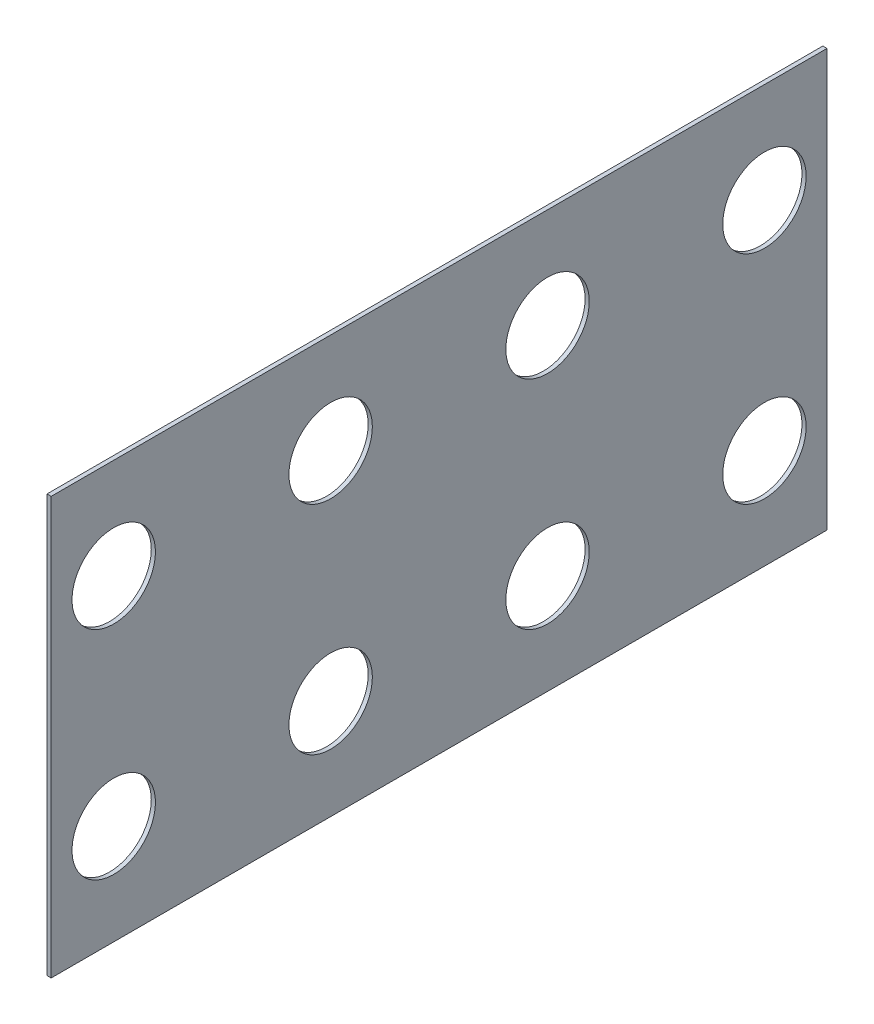
ISO-10303-21;
HEADER;
FILE_DESCRIPTION(('STEP AP214'),'2;1');
FILE_NAME('part.step','',(''),(''),'','','');
FILE_SCHEMA(('AUTOMOTIVE_DESIGN { 1 0 10303 214 1 1 1 1 }'));
ENDSEC;
DATA;
#1=APPLICATION_CONTEXT('core data for automotive mechanical design processes');
#2=APPLICATION_PROTOCOL_DEFINITION('international standard','automotive_design',2000,#1);
#3=PRODUCT_CONTEXT('',#1,'mechanical');
#4=PRODUCT('Part','Part','',(#3));
#5=PRODUCT_RELATED_PRODUCT_CATEGORY('part','',(#4));
#6=PRODUCT_DEFINITION_FORMATION('','',#4);
#7=PRODUCT_DEFINITION_CONTEXT('part definition',#1,'design');
#8=PRODUCT_DEFINITION('design','',#6,#7);
#9=PRODUCT_DEFINITION_SHAPE('','',#8);
#10=(LENGTH_UNIT() NAMED_UNIT(*) SI_UNIT(.MILLI.,.METRE.));
#11=(NAMED_UNIT(*) PLANE_ANGLE_UNIT() SI_UNIT($,.RADIAN.));
#12=(NAMED_UNIT(*) SI_UNIT($,.STERADIAN.) SOLID_ANGLE_UNIT());
#13=UNCERTAINTY_MEASURE_WITH_UNIT(LENGTH_MEASURE(1.E-05),#10,'distance_accuracy_value','');
#14=(GEOMETRIC_REPRESENTATION_CONTEXT(3) GLOBAL_UNCERTAINTY_ASSIGNED_CONTEXT((#13)) GLOBAL_UNIT_ASSIGNED_CONTEXT((#10,
#11,#12)) REPRESENTATION_CONTEXT('',''));
#15=CARTESIAN_POINT('',(0.,0.,0.));
#16=DIRECTION('',(0.,0.,1.));
#17=DIRECTION('',(1.,0.,0.));
#18=AXIS2_PLACEMENT_3D('',#15,#16,#17);
#19=CARTESIAN_POINT('',(5.,-250.,465.));
#20=DIRECTION('',(0.,0.,-1.));
#21=DIRECTION('',(-1.,0.,0.));
#22=AXIS2_PLACEMENT_3D('',#19,#20,#21);
#23=PLANE('',#22);
#24=DIRECTION('',(0.,-1.,0.));
#25=VECTOR('',#24,1.);
#26=CARTESIAN_POINT('',(0.,-250.,465.));
#27=LINE('',#26,#25);
#28=CARTESIAN_POINT('',(0.,250.,465.));
#29=VERTEX_POINT('',#28);
#30=CARTESIAN_POINT('',(0.,-250.,465.));
#31=VERTEX_POINT('',#30);
#32=EDGE_CURVE('E98',#29,#31,#27,.T.);
#33=ORIENTED_EDGE('',*,*,#32,.T.);
#34=DIRECTION('',(-1.,0.,0.));
#35=VECTOR('',#34,1.);
#36=CARTESIAN_POINT('',(5.,-250.,465.));
#37=LINE('',#36,#35);
#38=CARTESIAN_POINT('',(5.,-250.,465.));
#39=VERTEX_POINT('',#38);
#40=EDGE_CURVE('E11',#39,#31,#37,.T.);
#41=ORIENTED_EDGE('',*,*,#40,.F.);
#42=DIRECTION('',(0.,-1.,0.));
#43=VECTOR('',#42,1.);
#44=CARTESIAN_POINT('',(5.,-250.,465.));
#45=LINE('',#44,#43);
#46=CARTESIAN_POINT('',(5.,250.,465.));
#47=VERTEX_POINT('',#46);
#48=EDGE_CURVE('E86',#47,#39,#45,.T.);
#49=ORIENTED_EDGE('',*,*,#48,.F.);
#50=DIRECTION('',(-1.,0.,0.));
#51=VECTOR('',#50,1.);
#52=CARTESIAN_POINT('',(5.,250.,465.));
#53=LINE('',#52,#51);
#54=EDGE_CURVE('E94',#47,#29,#53,.T.);
#55=ORIENTED_EDGE('',*,*,#54,.T.);
#56=EDGE_LOOP('',(#33,#41,#49,#55));
#57=FACE_BOUND('',#56,.T.);
#58=ADVANCED_FACE('F35',(#57),#23,.F.);
#59=CARTESIAN_POINT('',(5.,-250.,-465.));
#60=DIRECTION('',(0.,1.,0.));
#61=DIRECTION('',(0.,0.,1.));
#62=AXIS2_PLACEMENT_3D('',#59,#60,#61);
#63=PLANE('',#62);
#64=DIRECTION('',(0.,0.,-1.));
#65=VECTOR('',#64,1.);
#66=CARTESIAN_POINT('',(0.,-250.,-465.));
#67=LINE('',#66,#65);
#68=CARTESIAN_POINT('',(0.,-250.,-465.));
#69=VERTEX_POINT('',#68);
#70=EDGE_CURVE('E90',#31,#69,#67,.T.);
#71=ORIENTED_EDGE('',*,*,#70,.T.);
#72=DIRECTION('',(-1.,0.,0.));
#73=VECTOR('',#72,1.);
#74=CARTESIAN_POINT('',(5.,-250.,-465.));
#75=LINE('',#74,#73);
#76=CARTESIAN_POINT('',(5.,-250.,-465.));
#77=VERTEX_POINT('',#76);
#78=EDGE_CURVE('E43',#77,#69,#75,.T.);
#79=ORIENTED_EDGE('',*,*,#78,.F.);
#80=DIRECTION('',(0.,0.,-1.));
#81=VECTOR('',#80,1.);
#82=CARTESIAN_POINT('',(5.,-250.,-465.));
#83=LINE('',#82,#81);
#84=EDGE_CURVE('E81',#39,#77,#83,.T.);
#85=ORIENTED_EDGE('',*,*,#84,.F.);
#86=ORIENTED_EDGE('',*,*,#40,.T.);
#87=EDGE_LOOP('',(#71,#79,#85,#86));
#88=FACE_BOUND('',#87,.T.);
#89=ADVANCED_FACE('F89',(#88),#63,.F.);
#90=CARTESIAN_POINT('',(5.,-250.,-465.));
#91=DIRECTION('',(0.,0.,1.));
#92=DIRECTION('',(1.,0.,0.));
#93=AXIS2_PLACEMENT_3D('',#90,#91,#92);
#94=PLANE('',#93);
#95=DIRECTION('',(0.,1.,0.));
#96=VECTOR('',#95,1.);
#97=CARTESIAN_POINT('',(0.,-250.,-465.));
#98=LINE('',#97,#96);
#99=CARTESIAN_POINT('',(0.,250.,-465.));
#100=VERTEX_POINT('',#99);
#101=EDGE_CURVE('E68',#69,#100,#98,.T.);
#102=ORIENTED_EDGE('',*,*,#101,.T.);
#103=DIRECTION('',(-1.,0.,0.));
#104=VECTOR('',#103,1.);
#105=CARTESIAN_POINT('',(5.,250.,-465.));
#106=LINE('',#105,#104);
#107=CARTESIAN_POINT('',(5.,250.,-465.));
#108=VERTEX_POINT('',#107);
#109=EDGE_CURVE('E91',#108,#100,#106,.T.);
#110=ORIENTED_EDGE('',*,*,#109,.F.);
#111=DIRECTION('',(0.,1.,0.));
#112=VECTOR('',#111,1.);
#113=CARTESIAN_POINT('',(5.,-250.,-465.));
#114=LINE('',#113,#112);
#115=EDGE_CURVE('E84',#77,#108,#114,.T.);
#116=ORIENTED_EDGE('',*,*,#115,.F.);
#117=ORIENTED_EDGE('',*,*,#78,.T.);
#118=EDGE_LOOP('',(#102,#110,#116,#117));
#119=FACE_BOUND('',#118,.T.);
#120=ADVANCED_FACE('F92',(#119),#94,.F.);
#121=CARTESIAN_POINT('',(5.,250.,-465.));
#122=DIRECTION('',(0.,-1.,0.));
#123=DIRECTION('',(0.,0.,-1.));
#124=AXIS2_PLACEMENT_3D('',#121,#122,#123);
#125=PLANE('',#124);
#126=DIRECTION('',(0.,0.,1.));
#127=VECTOR('',#126,1.);
#128=CARTESIAN_POINT('',(0.,250.,-465.));
#129=LINE('',#128,#127);
#130=EDGE_CURVE('E74',#100,#29,#129,.T.);
#131=ORIENTED_EDGE('',*,*,#130,.T.);
#132=ORIENTED_EDGE('',*,*,#54,.F.);
#133=DIRECTION('',(0.,0.,1.));
#134=VECTOR('',#133,1.);
#135=CARTESIAN_POINT('',(5.,250.,-465.));
#136=LINE('',#135,#134);
#137=EDGE_CURVE('E51',#108,#47,#136,.T.);
#138=ORIENTED_EDGE('',*,*,#137,.F.);
#139=ORIENTED_EDGE('',*,*,#109,.T.);
#140=EDGE_LOOP('',(#131,#132,#138,#139));
#141=FACE_BOUND('',#140,.T.);
#142=ADVANCED_FACE('F106',(#141),#125,.F.);
#143=CARTESIAN_POINT('',(5.,250.,465.));
#144=DIRECTION('',(1.,0.,0.));
#145=DIRECTION('',(0.,0.,-1.));
#146=AXIS2_PLACEMENT_3D('',#143,#144,#145);
#147=PLANE('',#146);
#148=CARTESIAN_POINT('',(5.,-130.,-390.00000000002));
#149=DIRECTION('',(1.,0.,0.));
#150=DIRECTION('',(0.,0.,-1.));
#151=AXIS2_PLACEMENT_3D('',#148,#149,#150);
#152=CIRCLE('',#151,50.);
#153=CARTESIAN_POINT('',(5.,-130.,-440.00000000002));
#154=VERTEX_POINT('',#153);
#155=EDGE_CURVE('E154',#154,#154,#152,.T.);
#156=ORIENTED_EDGE('',*,*,#155,.F.);
#157=EDGE_LOOP('',(#156));
#158=FACE_BOUND('',#157,.T.);
#159=CARTESIAN_POINT('',(5.,-130.,-130.00000000002));
#160=DIRECTION('',(1.,0.,0.));
#161=DIRECTION('',(0.,0.,-1.));
#162=AXIS2_PLACEMENT_3D('',#159,#160,#161);
#163=CIRCLE('',#162,50.);
#164=CARTESIAN_POINT('',(5.,-130.,-180.00000000002));
#165=VERTEX_POINT('',#164);
#166=EDGE_CURVE('E148',#165,#165,#163,.T.);
#167=ORIENTED_EDGE('',*,*,#166,.F.);
#168=EDGE_LOOP('',(#167));
#169=FACE_BOUND('',#168,.T.);
#170=CARTESIAN_POINT('',(5.,-130.,129.99999999998));
#171=DIRECTION('',(1.,0.,0.));
#172=DIRECTION('',(0.,0.,-1.));
#173=AXIS2_PLACEMENT_3D('',#170,#171,#172);
#174=CIRCLE('',#173,50.);
#175=CARTESIAN_POINT('',(5.,-130.,79.9999999999798));
#176=VERTEX_POINT('',#175);
#177=EDGE_CURVE('E142',#176,#176,#174,.T.);
#178=ORIENTED_EDGE('',*,*,#177,.F.);
#179=EDGE_LOOP('',(#178));
#180=FACE_BOUND('',#179,.T.);
#181=CARTESIAN_POINT('',(5.,-130.,389.99999999998));
#182=DIRECTION('',(1.,0.,0.));
#183=DIRECTION('',(0.,0.,-1.));
#184=AXIS2_PLACEMENT_3D('',#181,#182,#183);
#185=CIRCLE('',#184,50.);
#186=CARTESIAN_POINT('',(5.,-130.,339.99999999998));
#187=VERTEX_POINT('',#186);
#188=EDGE_CURVE('E136',#187,#187,#185,.T.);
#189=ORIENTED_EDGE('',*,*,#188,.F.);
#190=EDGE_LOOP('',(#189));
#191=FACE_BOUND('',#190,.T.);
#192=CARTESIAN_POINT('',(5.,130.,-390.00000000001));
#193=DIRECTION('',(1.,0.,0.));
#194=DIRECTION('',(0.,0.,-1.));
#195=AXIS2_PLACEMENT_3D('',#192,#193,#194);
#196=CIRCLE('',#195,50.);
#197=CARTESIAN_POINT('',(5.,130.,-440.00000000001));
#198=VERTEX_POINT('',#197);
#199=EDGE_CURVE('E130',#198,#198,#196,.T.);
#200=ORIENTED_EDGE('',*,*,#199,.F.);
#201=EDGE_LOOP('',(#200));
#202=FACE_BOUND('',#201,.T.);
#203=CARTESIAN_POINT('',(5.,130.,-130.00000000001));
#204=DIRECTION('',(1.,0.,0.));
#205=DIRECTION('',(0.,0.,-1.));
#206=AXIS2_PLACEMENT_3D('',#203,#204,#205);
#207=CIRCLE('',#206,50.);
#208=CARTESIAN_POINT('',(5.,130.,-180.00000000001));
#209=VERTEX_POINT('',#208);
#210=EDGE_CURVE('E124',#209,#209,#207,.T.);
#211=ORIENTED_EDGE('',*,*,#210,.F.);
#212=EDGE_LOOP('',(#211));
#213=FACE_BOUND('',#212,.T.);
#214=CARTESIAN_POINT('',(5.,130.,129.99999999999));
#215=DIRECTION('',(1.,0.,0.));
#216=DIRECTION('',(0.,0.,-1.));
#217=AXIS2_PLACEMENT_3D('',#214,#215,#216);
#218=CIRCLE('',#217,50.);
#219=CARTESIAN_POINT('',(5.,130.,79.9999999999899));
#220=VERTEX_POINT('',#219);
#221=EDGE_CURVE('E118',#220,#220,#218,.T.);
#222=ORIENTED_EDGE('',*,*,#221,.F.);
#223=EDGE_LOOP('',(#222));
#224=FACE_BOUND('',#223,.T.);
#225=CARTESIAN_POINT('',(5.,130.,389.99999999999));
#226=DIRECTION('',(1.,0.,0.));
#227=DIRECTION('',(0.,0.,-1.));
#228=AXIS2_PLACEMENT_3D('',#225,#226,#227);
#229=CIRCLE('',#228,50.);
#230=CARTESIAN_POINT('',(5.,130.,339.99999999999));
#231=VERTEX_POINT('',#230);
#232=EDGE_CURVE('E112',#231,#231,#229,.T.);
#233=ORIENTED_EDGE('',*,*,#232,.F.);
#234=EDGE_LOOP('',(#233));
#235=FACE_BOUND('',#234,.T.);
#236=ORIENTED_EDGE('',*,*,#48,.T.);
#237=ORIENTED_EDGE('',*,*,#84,.T.);
#238=ORIENTED_EDGE('',*,*,#115,.T.);
#239=ORIENTED_EDGE('',*,*,#137,.T.);
#240=EDGE_LOOP('',(#236,#237,#238,#239));
#241=FACE_BOUND('',#240,.T.);
#242=ADVANCED_FACE('F82',(#158,#169,#180,#191,#202,#213,#224,#235,#241),#147,.T.);
#243=CARTESIAN_POINT('',(0.,250.,465.));
#244=DIRECTION('',(1.,0.,0.));
#245=DIRECTION('',(0.,0.,-1.));
#246=AXIS2_PLACEMENT_3D('',#243,#244,#245);
#247=PLANE('',#246);
#248=CARTESIAN_POINT('',(0.,-130.,-390.00000000002));
#249=DIRECTION('',(1.,0.,0.));
#250=DIRECTION('',(0.,0.,-1.));
#251=AXIS2_PLACEMENT_3D('',#248,#249,#250);
#252=CIRCLE('',#251,50.);
#253=CARTESIAN_POINT('',(0.,-130.,-440.00000000002));
#254=VERTEX_POINT('',#253);
#255=EDGE_CURVE('E151',#254,#254,#252,.T.);
#256=ORIENTED_EDGE('',*,*,#255,.T.);
#257=EDGE_LOOP('',(#256));
#258=FACE_BOUND('',#257,.T.);
#259=CARTESIAN_POINT('',(0.,-130.,-130.00000000002));
#260=DIRECTION('',(1.,0.,0.));
#261=DIRECTION('',(0.,0.,-1.));
#262=AXIS2_PLACEMENT_3D('',#259,#260,#261);
#263=CIRCLE('',#262,50.);
#264=CARTESIAN_POINT('',(0.,-130.,-180.00000000002));
#265=VERTEX_POINT('',#264);
#266=EDGE_CURVE('E145',#265,#265,#263,.T.);
#267=ORIENTED_EDGE('',*,*,#266,.T.);
#268=EDGE_LOOP('',(#267));
#269=FACE_BOUND('',#268,.T.);
#270=CARTESIAN_POINT('',(0.,-130.,129.99999999998));
#271=DIRECTION('',(1.,0.,0.));
#272=DIRECTION('',(0.,0.,-1.));
#273=AXIS2_PLACEMENT_3D('',#270,#271,#272);
#274=CIRCLE('',#273,50.);
#275=CARTESIAN_POINT('',(0.,-130.,79.9999999999798));
#276=VERTEX_POINT('',#275);
#277=EDGE_CURVE('E139',#276,#276,#274,.T.);
#278=ORIENTED_EDGE('',*,*,#277,.T.);
#279=EDGE_LOOP('',(#278));
#280=FACE_BOUND('',#279,.T.);
#281=CARTESIAN_POINT('',(0.,-130.,389.99999999998));
#282=DIRECTION('',(1.,0.,0.));
#283=DIRECTION('',(0.,0.,-1.));
#284=AXIS2_PLACEMENT_3D('',#281,#282,#283);
#285=CIRCLE('',#284,50.);
#286=CARTESIAN_POINT('',(0.,-130.,339.99999999998));
#287=VERTEX_POINT('',#286);
#288=EDGE_CURVE('E133',#287,#287,#285,.T.);
#289=ORIENTED_EDGE('',*,*,#288,.T.);
#290=EDGE_LOOP('',(#289));
#291=FACE_BOUND('',#290,.T.);
#292=CARTESIAN_POINT('',(0.,130.,-390.00000000001));
#293=DIRECTION('',(1.,0.,0.));
#294=DIRECTION('',(0.,0.,-1.));
#295=AXIS2_PLACEMENT_3D('',#292,#293,#294);
#296=CIRCLE('',#295,50.);
#297=CARTESIAN_POINT('',(0.,130.,-440.00000000001));
#298=VERTEX_POINT('',#297);
#299=EDGE_CURVE('E127',#298,#298,#296,.T.);
#300=ORIENTED_EDGE('',*,*,#299,.T.);
#301=EDGE_LOOP('',(#300));
#302=FACE_BOUND('',#301,.T.);
#303=CARTESIAN_POINT('',(0.,130.,-130.00000000001));
#304=DIRECTION('',(1.,0.,0.));
#305=DIRECTION('',(0.,0.,-1.));
#306=AXIS2_PLACEMENT_3D('',#303,#304,#305);
#307=CIRCLE('',#306,50.);
#308=CARTESIAN_POINT('',(0.,130.,-180.00000000001));
#309=VERTEX_POINT('',#308);
#310=EDGE_CURVE('E121',#309,#309,#307,.T.);
#311=ORIENTED_EDGE('',*,*,#310,.T.);
#312=EDGE_LOOP('',(#311));
#313=FACE_BOUND('',#312,.T.);
#314=CARTESIAN_POINT('',(0.,130.,129.99999999999));
#315=DIRECTION('',(1.,0.,0.));
#316=DIRECTION('',(0.,0.,-1.));
#317=AXIS2_PLACEMENT_3D('',#314,#315,#316);
#318=CIRCLE('',#317,50.);
#319=CARTESIAN_POINT('',(0.,130.,79.9999999999899));
#320=VERTEX_POINT('',#319);
#321=EDGE_CURVE('E115',#320,#320,#318,.T.);
#322=ORIENTED_EDGE('',*,*,#321,.T.);
#323=EDGE_LOOP('',(#322));
#324=FACE_BOUND('',#323,.T.);
#325=CARTESIAN_POINT('',(0.,130.,389.99999999999));
#326=DIRECTION('',(1.,0.,0.));
#327=DIRECTION('',(0.,0.,-1.));
#328=AXIS2_PLACEMENT_3D('',#325,#326,#327);
#329=CIRCLE('',#328,50.);
#330=CARTESIAN_POINT('',(0.,130.,339.99999999999));
#331=VERTEX_POINT('',#330);
#332=EDGE_CURVE('E101',#331,#331,#329,.T.);
#333=ORIENTED_EDGE('',*,*,#332,.T.);
#334=EDGE_LOOP('',(#333));
#335=FACE_BOUND('',#334,.T.);
#336=ORIENTED_EDGE('',*,*,#32,.F.);
#337=ORIENTED_EDGE('',*,*,#130,.F.);
#338=ORIENTED_EDGE('',*,*,#101,.F.);
#339=ORIENTED_EDGE('',*,*,#70,.F.);
#340=EDGE_LOOP('',(#336,#337,#338,#339));
#341=FACE_BOUND('',#340,.T.);
#342=ADVANCED_FACE('F109',(#258,#269,#280,#291,#302,#313,#324,#335,#341),#247,.F.);
#343=CARTESIAN_POINT('',(0.,130.,389.99999999999));
#344=DIRECTION('',(1.,0.,0.));
#345=DIRECTION('',(0.,0.,-1.));
#346=AXIS2_PLACEMENT_3D('',#343,#344,#345);
#347=CYLINDRICAL_SURFACE('',#346,50.);
#348=ORIENTED_EDGE('',*,*,#332,.F.);
#349=EDGE_LOOP('',(#348));
#350=FACE_BOUND('',#349,.T.);
#351=ORIENTED_EDGE('',*,*,#232,.T.);
#352=EDGE_LOOP('',(#351));
#353=FACE_BOUND('',#352,.T.);
#354=ADVANCED_FACE('F186',(#350,#353),#347,.F.);
#355=CARTESIAN_POINT('',(0.,130.,129.99999999999));
#356=DIRECTION('',(1.,0.,0.));
#357=DIRECTION('',(0.,0.,-1.));
#358=AXIS2_PLACEMENT_3D('',#355,#356,#357);
#359=CYLINDRICAL_SURFACE('',#358,50.);
#360=ORIENTED_EDGE('',*,*,#321,.F.);
#361=EDGE_LOOP('',(#360));
#362=FACE_BOUND('',#361,.T.);
#363=ORIENTED_EDGE('',*,*,#221,.T.);
#364=EDGE_LOOP('',(#363));
#365=FACE_BOUND('',#364,.T.);
#366=ADVANCED_FACE('F188',(#362,#365),#359,.F.);
#367=CARTESIAN_POINT('',(0.,130.,-130.00000000001));
#368=DIRECTION('',(1.,0.,0.));
#369=DIRECTION('',(0.,0.,-1.));
#370=AXIS2_PLACEMENT_3D('',#367,#368,#369);
#371=CYLINDRICAL_SURFACE('',#370,50.);
#372=ORIENTED_EDGE('',*,*,#310,.F.);
#373=EDGE_LOOP('',(#372));
#374=FACE_BOUND('',#373,.T.);
#375=ORIENTED_EDGE('',*,*,#210,.T.);
#376=EDGE_LOOP('',(#375));
#377=FACE_BOUND('',#376,.T.);
#378=ADVANCED_FACE('F195',(#374,#377),#371,.F.);
#379=CARTESIAN_POINT('',(0.,130.,-390.00000000001));
#380=DIRECTION('',(1.,0.,0.));
#381=DIRECTION('',(0.,0.,-1.));
#382=AXIS2_PLACEMENT_3D('',#379,#380,#381);
#383=CYLINDRICAL_SURFACE('',#382,50.);
#384=ORIENTED_EDGE('',*,*,#299,.F.);
#385=EDGE_LOOP('',(#384));
#386=FACE_BOUND('',#385,.T.);
#387=ORIENTED_EDGE('',*,*,#199,.T.);
#388=EDGE_LOOP('',(#387));
#389=FACE_BOUND('',#388,.T.);
#390=ADVANCED_FACE('F241',(#386,#389),#383,.F.);
#391=CARTESIAN_POINT('',(0.,-130.,389.99999999998));
#392=DIRECTION('',(1.,0.,0.));
#393=DIRECTION('',(0.,0.,-1.));
#394=AXIS2_PLACEMENT_3D('',#391,#392,#393);
#395=CYLINDRICAL_SURFACE('',#394,50.);
#396=ORIENTED_EDGE('',*,*,#288,.F.);
#397=EDGE_LOOP('',(#396));
#398=FACE_BOUND('',#397,.T.);
#399=ORIENTED_EDGE('',*,*,#188,.T.);
#400=EDGE_LOOP('',(#399));
#401=FACE_BOUND('',#400,.T.);
#402=ADVANCED_FACE('F251',(#398,#401),#395,.F.);
#403=CARTESIAN_POINT('',(0.,-130.,129.99999999998));
#404=DIRECTION('',(1.,0.,0.));
#405=DIRECTION('',(0.,0.,-1.));
#406=AXIS2_PLACEMENT_3D('',#403,#404,#405);
#407=CYLINDRICAL_SURFACE('',#406,50.);
#408=ORIENTED_EDGE('',*,*,#277,.F.);
#409=EDGE_LOOP('',(#408));
#410=FACE_BOUND('',#409,.T.);
#411=ORIENTED_EDGE('',*,*,#177,.T.);
#412=EDGE_LOOP('',(#411));
#413=FACE_BOUND('',#412,.T.);
#414=ADVANCED_FACE('F261',(#410,#413),#407,.F.);
#415=CARTESIAN_POINT('',(0.,-130.,-130.00000000002));
#416=DIRECTION('',(1.,0.,0.));
#417=DIRECTION('',(0.,0.,-1.));
#418=AXIS2_PLACEMENT_3D('',#415,#416,#417);
#419=CYLINDRICAL_SURFACE('',#418,50.);
#420=ORIENTED_EDGE('',*,*,#266,.F.);
#421=EDGE_LOOP('',(#420));
#422=FACE_BOUND('',#421,.T.);
#423=ORIENTED_EDGE('',*,*,#166,.T.);
#424=EDGE_LOOP('',(#423));
#425=FACE_BOUND('',#424,.T.);
#426=ADVANCED_FACE('F165',(#422,#425),#419,.F.);
#427=CARTESIAN_POINT('',(0.,-130.,-390.00000000002));
#428=DIRECTION('',(1.,0.,0.));
#429=DIRECTION('',(0.,0.,-1.));
#430=AXIS2_PLACEMENT_3D('',#427,#428,#429);
#431=CYLINDRICAL_SURFACE('',#430,50.);
#432=ORIENTED_EDGE('',*,*,#255,.F.);
#433=EDGE_LOOP('',(#432));
#434=FACE_BOUND('',#433,.T.);
#435=ORIENTED_EDGE('',*,*,#155,.T.);
#436=EDGE_LOOP('',(#435));
#437=FACE_BOUND('',#436,.T.);
#438=ADVANCED_FACE('F162',(#434,#437),#431,.F.);
#439=CLOSED_SHELL('',(#58,#89,#120,#142,#242,#342,#354,#366,#378,#390,#402,#414,#426,#438));
#440=MANIFOLD_SOLID_BREP('B2',#439);
#441=ADVANCED_BREP_SHAPE_REPRESENTATION('',(#18,#440),#14);
#442=SHAPE_DEFINITION_REPRESENTATION(#9,#441);
ENDSEC;
END-ISO-10303-21;
